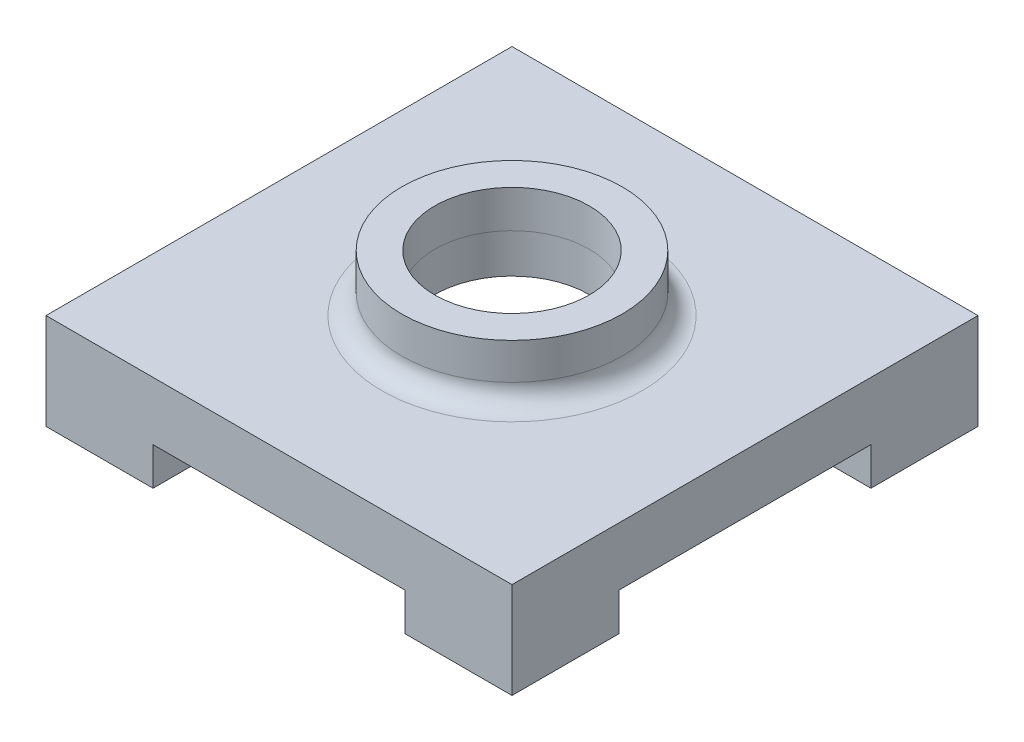
ISO-10303-21;
HEADER;
FILE_DESCRIPTION(('STEP AP214'),'2;1');
FILE_NAME('part.step','',(''),(''),'','','');
FILE_SCHEMA(('AUTOMOTIVE_DESIGN { 1 0 10303 214 1 1 1 1 }'));
ENDSEC;
DATA;
#1=APPLICATION_CONTEXT('core data for automotive mechanical design processes');
#2=APPLICATION_PROTOCOL_DEFINITION('international standard','automotive_design',2000,#1);
#3=PRODUCT_CONTEXT('',#1,'mechanical');
#4=PRODUCT('Part','Part','',(#3));
#5=PRODUCT_RELATED_PRODUCT_CATEGORY('part','',(#4));
#6=PRODUCT_DEFINITION_FORMATION('','',#4);
#7=PRODUCT_DEFINITION_CONTEXT('part definition',#1,'design');
#8=PRODUCT_DEFINITION('design','',#6,#7);
#9=PRODUCT_DEFINITION_SHAPE('','',#8);
#10=(LENGTH_UNIT() NAMED_UNIT(*) SI_UNIT(.MILLI.,.METRE.));
#11=(NAMED_UNIT(*) PLANE_ANGLE_UNIT() SI_UNIT($,.RADIAN.));
#12=(NAMED_UNIT(*) SI_UNIT($,.STERADIAN.) SOLID_ANGLE_UNIT());
#13=UNCERTAINTY_MEASURE_WITH_UNIT(LENGTH_MEASURE(1.E-05),#10,'distance_accuracy_value','');
#14=(GEOMETRIC_REPRESENTATION_CONTEXT(3) GLOBAL_UNCERTAINTY_ASSIGNED_CONTEXT((#13)) GLOBAL_UNIT_ASSIGNED_CONTEXT((#10,
#11,#12)) REPRESENTATION_CONTEXT('',''));
#15=CARTESIAN_POINT('',(0.,0.,0.));
#16=DIRECTION('',(0.,0.,1.));
#17=DIRECTION('',(1.,0.,0.));
#18=AXIS2_PLACEMENT_3D('',#15,#16,#17);
#19=CARTESIAN_POINT('',(0.,18.25,0.));
#20=DIRECTION('',(0.,1.,0.));
#21=DIRECTION('',(0.,0.,1.));
#22=AXIS2_PLACEMENT_3D('',#19,#20,#21);
#23=CYLINDRICAL_SURFACE('',#22,12.2682);
#24=CARTESIAN_POINT('',(0.,18.25,0.));
#25=DIRECTION('',(0.,1.,0.));
#26=DIRECTION('',(0.,0.,1.));
#27=AXIS2_PLACEMENT_3D('',#24,#25,#26);
#28=CIRCLE('',#27,12.2682);
#29=CARTESIAN_POINT('',(0.,18.25,12.2682));
#30=VERTEX_POINT('',#29);
#31=EDGE_CURVE('E416',#30,#30,#28,.F.);
#32=ORIENTED_EDGE('',*,*,#31,.F.);
#33=EDGE_LOOP('',(#32));
#34=FACE_BOUND('',#33,.T.);
#35=CARTESIAN_POINT('',(0.,12.,0.));
#36=DIRECTION('',(0.,-1.,0.));
#37=DIRECTION('',(0.,0.,-1.));
#38=AXIS2_PLACEMENT_3D('',#35,#36,#37);
#39=CIRCLE('',#38,12.2682);
#40=CARTESIAN_POINT('',(0.,12.,-12.2682));
#41=VERTEX_POINT('',#40);
#42=EDGE_CURVE('E48',#41,#41,#39,.F.);
#43=ORIENTED_EDGE('',*,*,#42,.F.);
#44=EDGE_LOOP('',(#43));
#45=FACE_BOUND('',#44,.T.);
#46=ADVANCED_FACE('F44',(#34,#45),#23,.F.);
#47=CARTESIAN_POINT('',(0.,6.,0.));
#48=DIRECTION('',(0.,1.,0.));
#49=DIRECTION('',(0.,0.,1.));
#50=AXIS2_PLACEMENT_3D('',#47,#48,#49);
#51=PLANE('',#50);
#52=DIRECTION('',(0.,0.,1.));
#53=VECTOR('',#52,1.);
#54=CARTESIAN_POINT('',(-37.,6.,0.));
#55=LINE('',#54,#53);
#56=CARTESIAN_POINT('',(-37.,6.,-20.));
#57=VERTEX_POINT('',#56);
#58=CARTESIAN_POINT('',(-37.,6.,20.));
#59=VERTEX_POINT('',#58);
#60=EDGE_CURVE('E310',#57,#59,#55,.T.);
#61=ORIENTED_EDGE('',*,*,#60,.F.);
#62=DIRECTION('',(1.,0.,0.));
#63=VECTOR('',#62,1.);
#64=CARTESIAN_POINT('',(-40.,6.,-20.));
#65=LINE('',#64,#63);
#66=CARTESIAN_POINT('',(-30.,6.,-20.));
#67=VERTEX_POINT('',#66);
#68=EDGE_CURVE('E396',#57,#67,#65,.T.);
#69=ORIENTED_EDGE('',*,*,#68,.T.);
#70=DIRECTION('',(0.,0.,1.));
#71=VECTOR('',#70,1.);
#72=CARTESIAN_POINT('',(-30.,6.,0.));
#73=LINE('',#72,#71);
#74=CARTESIAN_POINT('',(-30.,6.,20.));
#75=VERTEX_POINT('',#74);
#76=EDGE_CURVE('E371',#67,#75,#73,.T.);
#77=ORIENTED_EDGE('',*,*,#76,.T.);
#78=DIRECTION('',(-1.,0.,0.));
#79=VECTOR('',#78,1.);
#80=CARTESIAN_POINT('',(40.,6.,20.));
#81=LINE('',#80,#79);
#82=EDGE_CURVE('E398',#75,#59,#81,.T.);
#83=ORIENTED_EDGE('',*,*,#82,.T.);
#84=EDGE_LOOP('',(#61,#69,#77,#83));
#85=FACE_BOUND('',#84,.T.);
#86=ADVANCED_FACE('F479',(#85),#51,.F.);
#87=DIRECTION('',(1.,0.,0.));
#88=VECTOR('',#87,1.);
#89=CARTESIAN_POINT('',(0.,6.,37.));
#90=LINE('',#89,#88);
#91=CARTESIAN_POINT('',(-20.,6.,37.));
#92=VERTEX_POINT('',#91);
#93=CARTESIAN_POINT('',(20.,6.,37.));
#94=VERTEX_POINT('',#93);
#95=EDGE_CURVE('E325',#92,#94,#90,.T.);
#96=ORIENTED_EDGE('',*,*,#95,.F.);
#97=DIRECTION('',(0.,0.,-1.));
#98=VECTOR('',#97,1.);
#99=CARTESIAN_POINT('',(-20.,6.,-40.));
#100=LINE('',#99,#98);
#101=CARTESIAN_POINT('',(-20.,6.,30.));
#102=VERTEX_POINT('',#101);
#103=EDGE_CURVE('E420',#92,#102,#100,.T.);
#104=ORIENTED_EDGE('',*,*,#103,.T.);
#105=DIRECTION('',(1.,0.,0.));
#106=VECTOR('',#105,1.);
#107=CARTESIAN_POINT('',(0.,6.,30.));
#108=LINE('',#107,#106);
#109=CARTESIAN_POINT('',(20.,6.,30.));
#110=VERTEX_POINT('',#109);
#111=EDGE_CURVE('E440',#102,#110,#108,.T.);
#112=ORIENTED_EDGE('',*,*,#111,.T.);
#113=DIRECTION('',(0.,0.,1.));
#114=VECTOR('',#113,1.);
#115=CARTESIAN_POINT('',(20.,6.,40.));
#116=LINE('',#115,#114);
#117=EDGE_CURVE('E422',#110,#94,#116,.T.);
#118=ORIENTED_EDGE('',*,*,#117,.T.);
#119=EDGE_LOOP('',(#96,#104,#112,#118));
#120=FACE_BOUND('',#119,.T.);
#121=ADVANCED_FACE('F530',(#120),#51,.F.);
#122=DIRECTION('',(0.,0.,-1.));
#123=VECTOR('',#122,1.);
#124=CARTESIAN_POINT('',(37.,6.,0.));
#125=LINE('',#124,#123);
#126=CARTESIAN_POINT('',(37.,6.,20.));
#127=VERTEX_POINT('',#126);
#128=CARTESIAN_POINT('',(37.,6.,-20.));
#129=VERTEX_POINT('',#128);
#130=EDGE_CURVE('E319',#127,#129,#125,.T.);
#131=ORIENTED_EDGE('',*,*,#130,.F.);
#132=CARTESIAN_POINT('',(30.,6.,20.));
#133=VERTEX_POINT('',#132);
#134=EDGE_CURVE('E400',#127,#133,#81,.T.);
#135=ORIENTED_EDGE('',*,*,#134,.T.);
#136=DIRECTION('',(0.,0.,-1.));
#137=VECTOR('',#136,1.);
#138=CARTESIAN_POINT('',(30.,6.,0.));
#139=LINE('',#138,#137);
#140=CARTESIAN_POINT('',(30.,6.,-20.));
#141=VERTEX_POINT('',#140);
#142=EDGE_CURVE('E377',#133,#141,#139,.T.);
#143=ORIENTED_EDGE('',*,*,#142,.T.);
#144=EDGE_CURVE('E399',#141,#129,#65,.T.);
#145=ORIENTED_EDGE('',*,*,#144,.T.);
#146=EDGE_LOOP('',(#131,#135,#143,#145));
#147=FACE_BOUND('',#146,.T.);
#148=ADVANCED_FACE('F551',(#147),#51,.F.);
#149=CARTESIAN_POINT('',(-40.,0.,0.));
#150=DIRECTION('',(0.,-1.,0.));
#151=DIRECTION('',(0.,0.,-1.));
#152=AXIS2_PLACEMENT_3D('',#149,#150,#151);
#153=PLANE('',#152);
#154=CARTESIAN_POINT('',(-32.5,0.,32.5));
#155=DIRECTION('',(0.,-1.,0.));
#156=DIRECTION('',(0.,0.,-1.));
#157=AXIS2_PLACEMENT_3D('',#154,#155,#156);
#158=CIRCLE('',#157,1.65);
#159=CARTESIAN_POINT('',(-32.5,0.,30.85));
#160=VERTEX_POINT('',#159);
#161=EDGE_CURVE('E353',#160,#160,#158,.T.);
#162=ORIENTED_EDGE('',*,*,#161,.F.);
#163=EDGE_LOOP('',(#162));
#164=FACE_BOUND('',#163,.T.);
#165=DIRECTION('',(1.,0.,0.));
#166=VECTOR('',#165,1.);
#167=CARTESIAN_POINT('',(-37.,0.,37.));
#168=LINE('',#167,#166);
#169=CARTESIAN_POINT('',(-37.,0.,37.));
#170=VERTEX_POINT('',#169);
#171=CARTESIAN_POINT('',(-20.,0.,37.));
#172=VERTEX_POINT('',#171);
#173=EDGE_CURVE('E289',#170,#172,#168,.T.);
#174=ORIENTED_EDGE('',*,*,#173,.F.);
#175=DIRECTION('',(0.,0.,1.));
#176=VECTOR('',#175,1.);
#177=CARTESIAN_POINT('',(-37.,0.,-37.));
#178=LINE('',#177,#176);
#179=CARTESIAN_POINT('',(-37.,0.,20.));
#180=VERTEX_POINT('',#179);
#181=EDGE_CURVE('E288',#180,#170,#178,.T.);
#182=ORIENTED_EDGE('',*,*,#181,.F.);
#183=DIRECTION('',(-1.,0.,0.));
#184=VECTOR('',#183,1.);
#185=CARTESIAN_POINT('',(40.,0.,20.));
#186=LINE('',#185,#184);
#187=CARTESIAN_POINT('',(-30.,0.,20.));
#188=VERTEX_POINT('',#187);
#189=EDGE_CURVE('E405',#188,#180,#186,.T.);
#190=ORIENTED_EDGE('',*,*,#189,.F.);
#191=DIRECTION('',(0.,0.,-1.));
#192=VECTOR('',#191,1.);
#193=CARTESIAN_POINT('',(-30.,0.,30.));
#194=LINE('',#193,#192);
#195=CARTESIAN_POINT('',(-30.,0.,26.825));
#196=VERTEX_POINT('',#195);
#197=EDGE_CURVE('E360',#196,#188,#194,.T.);
#198=ORIENTED_EDGE('',*,*,#197,.F.);
#199=CARTESIAN_POINT('',(-26.825,0.,26.825));
#200=DIRECTION('',(0.,-1.,0.));
#201=DIRECTION('',(0.,0.,-1.));
#202=AXIS2_PLACEMENT_3D('',#199,#200,#201);
#203=CIRCLE('',#202,3.175);
#204=CARTESIAN_POINT('',(-26.825,0.,30.));
#205=VERTEX_POINT('',#204);
#206=EDGE_CURVE('E464',#196,#205,#203,.F.);
#207=ORIENTED_EDGE('',*,*,#206,.T.);
#208=DIRECTION('',(-1.,0.,0.));
#209=VECTOR('',#208,1.);
#210=CARTESIAN_POINT('',(30.,0.,30.));
#211=LINE('',#210,#209);
#212=CARTESIAN_POINT('',(-20.,0.,30.));
#213=VERTEX_POINT('',#212);
#214=EDGE_CURVE('E368',#213,#205,#211,.T.);
#215=ORIENTED_EDGE('',*,*,#214,.F.);
#216=DIRECTION('',(0.,0.,-1.));
#217=VECTOR('',#216,1.);
#218=CARTESIAN_POINT('',(-20.,0.,-40.));
#219=LINE('',#218,#217);
#220=EDGE_CURVE('E427',#172,#213,#219,.T.);
#221=ORIENTED_EDGE('',*,*,#220,.F.);
#222=EDGE_LOOP('',(#174,#182,#190,#198,#207,#215,#221));
#223=FACE_BOUND('',#222,.T.);
#224=ADVANCED_FACE('F508',(#164,#223),#153,.T.);
#225=CARTESIAN_POINT('',(32.5,0.,32.5));
#226=DIRECTION('',(0.,-1.,0.));
#227=DIRECTION('',(0.,0.,-1.));
#228=AXIS2_PLACEMENT_3D('',#225,#226,#227);
#229=CIRCLE('',#228,1.65);
#230=CARTESIAN_POINT('',(32.5,0.,30.85));
#231=VERTEX_POINT('',#230);
#232=EDGE_CURVE('E347',#231,#231,#229,.T.);
#233=ORIENTED_EDGE('',*,*,#232,.F.);
#234=EDGE_LOOP('',(#233));
#235=FACE_BOUND('',#234,.T.);
#236=CARTESIAN_POINT('',(37.,0.,20.));
#237=VERTEX_POINT('',#236);
#238=CARTESIAN_POINT('',(30.,0.,20.));
#239=VERTEX_POINT('',#238);
#240=EDGE_CURVE('E406',#237,#239,#186,.T.);
#241=ORIENTED_EDGE('',*,*,#240,.F.);
#242=DIRECTION('',(0.,0.,-1.));
#243=VECTOR('',#242,1.);
#244=CARTESIAN_POINT('',(37.,0.,37.));
#245=LINE('',#244,#243);
#246=CARTESIAN_POINT('',(37.,0.,37.));
#247=VERTEX_POINT('',#246);
#248=EDGE_CURVE('E292',#247,#237,#245,.T.);
#249=ORIENTED_EDGE('',*,*,#248,.F.);
#250=CARTESIAN_POINT('',(20.,0.,37.));
#251=VERTEX_POINT('',#250);
#252=EDGE_CURVE('E287',#251,#247,#168,.T.);
#253=ORIENTED_EDGE('',*,*,#252,.F.);
#254=DIRECTION('',(0.,0.,1.));
#255=VECTOR('',#254,1.);
#256=CARTESIAN_POINT('',(20.,0.,40.));
#257=LINE('',#256,#255);
#258=CARTESIAN_POINT('',(20.,0.,30.));
#259=VERTEX_POINT('',#258);
#260=EDGE_CURVE('E429',#259,#251,#257,.T.);
#261=ORIENTED_EDGE('',*,*,#260,.F.);
#262=CARTESIAN_POINT('',(26.825,0.,30.));
#263=VERTEX_POINT('',#262);
#264=EDGE_CURVE('E369',#263,#259,#211,.T.);
#265=ORIENTED_EDGE('',*,*,#264,.F.);
#266=CARTESIAN_POINT('',(26.825,0.,26.825));
#267=DIRECTION('',(0.,-1.,0.));
#268=DIRECTION('',(0.,0.,-1.));
#269=AXIS2_PLACEMENT_3D('',#266,#267,#268);
#270=CIRCLE('',#269,3.175);
#271=CARTESIAN_POINT('',(30.,0.,26.825));
#272=VERTEX_POINT('',#271);
#273=EDGE_CURVE('E250',#263,#272,#270,.F.);
#274=ORIENTED_EDGE('',*,*,#273,.T.);
#275=DIRECTION('',(0.,0.,1.));
#276=VECTOR('',#275,1.);
#277=CARTESIAN_POINT('',(30.,0.,-30.));
#278=LINE('',#277,#276);
#279=EDGE_CURVE('E365',#239,#272,#278,.T.);
#280=ORIENTED_EDGE('',*,*,#279,.F.);
#281=EDGE_LOOP('',(#241,#249,#253,#261,#265,#274,#280));
#282=FACE_BOUND('',#281,.T.);
#283=ADVANCED_FACE('F540',(#235,#282),#153,.T.);
#284=CARTESIAN_POINT('',(-20.,6.,-40.));
#285=DIRECTION('',(-1.,0.,0.));
#286=DIRECTION('',(0.,0.,1.));
#287=AXIS2_PLACEMENT_3D('',#284,#285,#286);
#288=PLANE('',#287);
#289=DIRECTION('',(0.,1.,0.));
#290=VECTOR('',#289,1.);
#291=CARTESIAN_POINT('',(-20.,5.99999999999999,37.));
#292=LINE('',#291,#290);
#293=EDGE_CURVE('E327',#172,#92,#292,.T.);
#294=ORIENTED_EDGE('',*,*,#293,.F.);
#295=ORIENTED_EDGE('',*,*,#220,.T.);
#296=DIRECTION('',(0.,1.,0.));
#297=VECTOR('',#296,1.);
#298=CARTESIAN_POINT('',(-20.,6.,30.));
#299=LINE('',#298,#297);
#300=EDGE_CURVE('E392',#213,#102,#299,.T.);
#301=ORIENTED_EDGE('',*,*,#300,.T.);
#302=ORIENTED_EDGE('',*,*,#103,.F.);
#303=EDGE_LOOP('',(#294,#295,#301,#302));
#304=FACE_BOUND('',#303,.T.);
#305=ADVANCED_FACE('F523',(#304),#288,.F.);
#306=CARTESIAN_POINT('',(20.,6.,40.));
#307=DIRECTION('',(1.,0.,0.));
#308=DIRECTION('',(0.,0.,-1.));
#309=AXIS2_PLACEMENT_3D('',#306,#307,#308);
#310=PLANE('',#309);
#311=DIRECTION('',(0.,-1.,0.));
#312=VECTOR('',#311,1.);
#313=CARTESIAN_POINT('',(20.,6.,37.));
#314=LINE('',#313,#312);
#315=EDGE_CURVE('E323',#94,#251,#314,.T.);
#316=ORIENTED_EDGE('',*,*,#315,.F.);
#317=ORIENTED_EDGE('',*,*,#117,.F.);
#318=DIRECTION('',(0.,-1.,0.));
#319=VECTOR('',#318,1.);
#320=CARTESIAN_POINT('',(20.,6.,30.));
#321=LINE('',#320,#319);
#322=EDGE_CURVE('E389',#110,#259,#321,.T.);
#323=ORIENTED_EDGE('',*,*,#322,.T.);
#324=ORIENTED_EDGE('',*,*,#260,.T.);
#325=EDGE_LOOP('',(#316,#317,#323,#324));
#326=FACE_BOUND('',#325,.T.);
#327=ADVANCED_FACE('F533',(#326),#310,.F.);
#328=CARTESIAN_POINT('',(-32.5,0.,-32.5));
#329=DIRECTION('',(0.,-1.,0.));
#330=DIRECTION('',(0.,0.,-1.));
#331=AXIS2_PLACEMENT_3D('',#328,#329,#330);
#332=CIRCLE('',#331,1.65);
#333=CARTESIAN_POINT('',(-32.5,0.,-34.15));
#334=VERTEX_POINT('',#333);
#335=EDGE_CURVE('E335',#334,#334,#332,.T.);
#336=ORIENTED_EDGE('',*,*,#335,.F.);
#337=EDGE_LOOP('',(#336));
#338=FACE_BOUND('',#337,.T.);
#339=DIRECTION('',(1.,0.,0.));
#340=VECTOR('',#339,1.);
#341=CARTESIAN_POINT('',(-40.,0.,-20.));
#342=LINE('',#341,#340);
#343=CARTESIAN_POINT('',(-37.,0.,-20.));
#344=VERTEX_POINT('',#343);
#345=CARTESIAN_POINT('',(-30.,0.,-20.));
#346=VERTEX_POINT('',#345);
#347=EDGE_CURVE('E403',#344,#346,#342,.T.);
#348=ORIENTED_EDGE('',*,*,#347,.F.);
#349=CARTESIAN_POINT('',(-37.,0.,-37.));
#350=VERTEX_POINT('',#349);
#351=EDGE_CURVE('E68',#350,#344,#178,.T.);
#352=ORIENTED_EDGE('',*,*,#351,.F.);
#353=DIRECTION('',(-1.,0.,0.));
#354=VECTOR('',#353,1.);
#355=CARTESIAN_POINT('',(37.,0.,-37.));
#356=LINE('',#355,#354);
#357=CARTESIAN_POINT('',(-20.,0.,-37.));
#358=VERTEX_POINT('',#357);
#359=EDGE_CURVE('E294',#358,#350,#356,.T.);
#360=ORIENTED_EDGE('',*,*,#359,.F.);
#361=CARTESIAN_POINT('',(-20.,0.,-30.));
#362=VERTEX_POINT('',#361);
#363=EDGE_CURVE('E419',#362,#358,#219,.T.);
#364=ORIENTED_EDGE('',*,*,#363,.F.);
#365=DIRECTION('',(1.,0.,0.));
#366=VECTOR('',#365,1.);
#367=CARTESIAN_POINT('',(-30.,0.,-30.));
#368=LINE('',#367,#366);
#369=CARTESIAN_POINT('',(-26.825,0.,-30.));
#370=VERTEX_POINT('',#369);
#371=EDGE_CURVE('E363',#370,#362,#368,.T.);
#372=ORIENTED_EDGE('',*,*,#371,.F.);
#373=CARTESIAN_POINT('',(-26.825,0.,-26.825));
#374=DIRECTION('',(0.,-1.,0.));
#375=DIRECTION('',(0.,0.,-1.));
#376=AXIS2_PLACEMENT_3D('',#373,#374,#375);
#377=CIRCLE('',#376,3.175);
#378=CARTESIAN_POINT('',(-30.,0.,-26.825));
#379=VERTEX_POINT('',#378);
#380=EDGE_CURVE('E469',#370,#379,#377,.F.);
#381=ORIENTED_EDGE('',*,*,#380,.T.);
#382=EDGE_CURVE('E359',#346,#379,#194,.T.);
#383=ORIENTED_EDGE('',*,*,#382,.F.);
#384=EDGE_LOOP('',(#348,#352,#360,#364,#372,#381,#383));
#385=FACE_BOUND('',#384,.T.);
#386=ADVANCED_FACE('F490',(#338,#385),#153,.T.);
#387=CARTESIAN_POINT('',(32.5,0.,-32.5));
#388=DIRECTION('',(0.,-1.,0.));
#389=DIRECTION('',(0.,0.,-1.));
#390=AXIS2_PLACEMENT_3D('',#387,#388,#389);
#391=CIRCLE('',#390,1.65);
#392=CARTESIAN_POINT('',(32.5,0.,-34.15));
#393=VERTEX_POINT('',#392);
#394=EDGE_CURVE('E341',#393,#393,#391,.T.);
#395=ORIENTED_EDGE('',*,*,#394,.F.);
#396=EDGE_LOOP('',(#395));
#397=FACE_BOUND('',#396,.T.);
#398=CARTESIAN_POINT('',(20.,0.,-37.));
#399=VERTEX_POINT('',#398);
#400=CARTESIAN_POINT('',(20.,0.,-30.));
#401=VERTEX_POINT('',#400);
#402=EDGE_CURVE('E430',#399,#401,#257,.T.);
#403=ORIENTED_EDGE('',*,*,#402,.F.);
#404=CARTESIAN_POINT('',(37.,0.,-37.));
#405=VERTEX_POINT('',#404);
#406=EDGE_CURVE('E295',#405,#399,#356,.T.);
#407=ORIENTED_EDGE('',*,*,#406,.F.);
#408=CARTESIAN_POINT('',(37.,0.,-20.));
#409=VERTEX_POINT('',#408);
#410=EDGE_CURVE('E291',#409,#405,#245,.T.);
#411=ORIENTED_EDGE('',*,*,#410,.F.);
#412=CARTESIAN_POINT('',(30.,0.,-20.));
#413=VERTEX_POINT('',#412);
#414=EDGE_CURVE('E395',#413,#409,#342,.T.);
#415=ORIENTED_EDGE('',*,*,#414,.F.);
#416=CARTESIAN_POINT('',(30.,0.,-26.825));
#417=VERTEX_POINT('',#416);
#418=EDGE_CURVE('E366',#417,#413,#278,.T.);
#419=ORIENTED_EDGE('',*,*,#418,.F.);
#420=CARTESIAN_POINT('',(26.825,0.,-26.825));
#421=DIRECTION('',(0.,-1.,0.));
#422=DIRECTION('',(0.,0.,-1.));
#423=AXIS2_PLACEMENT_3D('',#420,#421,#422);
#424=CIRCLE('',#423,3.175);
#425=CARTESIAN_POINT('',(26.825,0.,-30.));
#426=VERTEX_POINT('',#425);
#427=EDGE_CURVE('E467',#417,#426,#424,.F.);
#428=ORIENTED_EDGE('',*,*,#427,.T.);
#429=EDGE_CURVE('E362',#401,#426,#368,.T.);
#430=ORIENTED_EDGE('',*,*,#429,.F.);
#431=EDGE_LOOP('',(#403,#407,#411,#415,#419,#428,#430));
#432=FACE_BOUND('',#431,.T.);
#433=ADVANCED_FACE('F566',(#397,#432),#153,.T.);
#434=DIRECTION('',(0.,-1.,0.));
#435=VECTOR('',#434,1.);
#436=CARTESIAN_POINT('',(-20.,6.,-37.));
#437=LINE('',#436,#435);
#438=CARTESIAN_POINT('',(-20.,6.,-37.));
#439=VERTEX_POINT('',#438);
#440=EDGE_CURVE('E333',#439,#358,#437,.T.);
#441=ORIENTED_EDGE('',*,*,#440,.F.);
#442=CARTESIAN_POINT('',(-20.,6.,-30.));
#443=VERTEX_POINT('',#442);
#444=EDGE_CURVE('E423',#443,#439,#100,.T.);
#445=ORIENTED_EDGE('',*,*,#444,.F.);
#446=DIRECTION('',(0.,-1.,0.));
#447=VECTOR('',#446,1.);
#448=CARTESIAN_POINT('',(-20.,6.,-30.));
#449=LINE('',#448,#447);
#450=EDGE_CURVE('E386',#443,#362,#449,.T.);
#451=ORIENTED_EDGE('',*,*,#450,.T.);
#452=ORIENTED_EDGE('',*,*,#363,.T.);
#453=EDGE_LOOP('',(#441,#445,#451,#452));
#454=FACE_BOUND('',#453,.T.);
#455=ADVANCED_FACE('F579',(#454),#288,.F.);
#456=DIRECTION('',(0.,1.,0.));
#457=VECTOR('',#456,1.);
#458=CARTESIAN_POINT('',(20.,6.00000000000001,-37.));
#459=LINE('',#458,#457);
#460=CARTESIAN_POINT('',(20.,6.,-37.));
#461=VERTEX_POINT('',#460);
#462=EDGE_CURVE('E331',#399,#461,#459,.T.);
#463=ORIENTED_EDGE('',*,*,#462,.F.);
#464=ORIENTED_EDGE('',*,*,#402,.T.);
#465=DIRECTION('',(0.,1.,0.));
#466=VECTOR('',#465,1.);
#467=CARTESIAN_POINT('',(20.,6.,-30.));
#468=LINE('',#467,#466);
#469=CARTESIAN_POINT('',(20.,6.,-30.));
#470=VERTEX_POINT('',#469);
#471=EDGE_CURVE('E383',#401,#470,#468,.T.);
#472=ORIENTED_EDGE('',*,*,#471,.T.);
#473=EDGE_CURVE('E424',#461,#470,#116,.T.);
#474=ORIENTED_EDGE('',*,*,#473,.F.);
#475=EDGE_LOOP('',(#463,#464,#472,#474));
#476=FACE_BOUND('',#475,.T.);
#477=ADVANCED_FACE('F589',(#476),#310,.F.);
#478=DIRECTION('',(-1.,0.,0.));
#479=VECTOR('',#478,1.);
#480=CARTESIAN_POINT('',(0.,6.,-37.));
#481=LINE('',#480,#479);
#482=EDGE_CURVE('E329',#461,#439,#481,.T.);
#483=ORIENTED_EDGE('',*,*,#482,.F.);
#484=ORIENTED_EDGE('',*,*,#473,.T.);
#485=DIRECTION('',(-1.,0.,0.));
#486=VECTOR('',#485,1.);
#487=CARTESIAN_POINT('',(0.,6.,-30.));
#488=LINE('',#487,#486);
#489=EDGE_CURVE('E437',#470,#443,#488,.T.);
#490=ORIENTED_EDGE('',*,*,#489,.T.);
#491=ORIENTED_EDGE('',*,*,#444,.T.);
#492=EDGE_LOOP('',(#483,#484,#490,#491));
#493=FACE_BOUND('',#492,.T.);
#494=ADVANCED_FACE('F586',(#493),#51,.F.);
#495=CARTESIAN_POINT('',(0.,15.25,0.));
#496=DIRECTION('',(0.,-1.,0.));
#497=DIRECTION('',(0.,0.,-1.));
#498=AXIS2_PLACEMENT_3D('',#495,#496,#497);
#499=PLANE('',#498);
#500=CARTESIAN_POINT('',(0.,15.25,0.));
#501=DIRECTION('',(0.,-1.,0.));
#502=DIRECTION('',(0.,0.,-1.));
#503=AXIS2_PLACEMENT_3D('',#500,#501,#502);
#504=CIRCLE('',#503,20.675);
#505=CARTESIAN_POINT('',(0.,15.25,-20.675));
#506=VERTEX_POINT('',#505);
#507=EDGE_CURVE('E461',#506,#506,#504,.T.);
#508=ORIENTED_EDGE('',*,*,#507,.T.);
#509=EDGE_LOOP('',(#508));
#510=FACE_BOUND('',#509,.T.);
#511=DIRECTION('',(0.,0.,1.));
#512=VECTOR('',#511,1.);
#513=CARTESIAN_POINT('',(-37.,15.25,-37.));
#514=LINE('',#513,#512);
#515=CARTESIAN_POINT('',(-37.,15.25,-37.));
#516=VERTEX_POINT('',#515);
#517=CARTESIAN_POINT('',(-37.,15.25,37.));
#518=VERTEX_POINT('',#517);
#519=EDGE_CURVE('E298',#516,#518,#514,.T.);
#520=ORIENTED_EDGE('',*,*,#519,.T.);
#521=DIRECTION('',(1.,0.,0.));
#522=VECTOR('',#521,1.);
#523=CARTESIAN_POINT('',(-37.,15.25,37.));
#524=LINE('',#523,#522);
#525=CARTESIAN_POINT('',(37.,15.25,37.));
#526=VERTEX_POINT('',#525);
#527=EDGE_CURVE('E301',#518,#526,#524,.T.);
#528=ORIENTED_EDGE('',*,*,#527,.T.);
#529=DIRECTION('',(0.,0.,-1.));
#530=VECTOR('',#529,1.);
#531=CARTESIAN_POINT('',(37.,15.25,37.));
#532=LINE('',#531,#530);
#533=CARTESIAN_POINT('',(37.,15.25,-37.));
#534=VERTEX_POINT('',#533);
#535=EDGE_CURVE('E60',#526,#534,#532,.T.);
#536=ORIENTED_EDGE('',*,*,#535,.T.);
#537=DIRECTION('',(-1.,0.,0.));
#538=VECTOR('',#537,1.);
#539=CARTESIAN_POINT('',(37.,15.25,-37.));
#540=LINE('',#539,#538);
#541=EDGE_CURVE('E305',#534,#516,#540,.T.);
#542=ORIENTED_EDGE('',*,*,#541,.T.);
#543=EDGE_LOOP('',(#520,#528,#536,#542));
#544=FACE_BOUND('',#543,.T.);
#545=ADVANCED_FACE('F574',(#510,#544),#499,.F.);
#546=CARTESIAN_POINT('',(-40.,6.,-20.));
#547=DIRECTION('',(0.,0.,-1.));
#548=DIRECTION('',(-1.,0.,0.));
#549=AXIS2_PLACEMENT_3D('',#546,#547,#548);
#550=PLANE('',#549);
#551=DIRECTION('',(0.,-1.,0.));
#552=VECTOR('',#551,1.);
#553=CARTESIAN_POINT('',(37.,6.,-20.));
#554=LINE('',#553,#552);
#555=EDGE_CURVE('E321',#129,#409,#554,.T.);
#556=ORIENTED_EDGE('',*,*,#555,.F.);
#557=ORIENTED_EDGE('',*,*,#144,.F.);
#558=DIRECTION('',(0.,-1.,0.));
#559=VECTOR('',#558,1.);
#560=CARTESIAN_POINT('',(30.,6.,-20.));
#561=LINE('',#560,#559);
#562=EDGE_CURVE('E380',#141,#413,#561,.T.);
#563=ORIENTED_EDGE('',*,*,#562,.T.);
#564=ORIENTED_EDGE('',*,*,#414,.T.);
#565=EDGE_LOOP('',(#556,#557,#563,#564));
#566=FACE_BOUND('',#565,.T.);
#567=ADVANCED_FACE('F562',(#566),#550,.F.);
#568=CARTESIAN_POINT('',(40.,6.,20.));
#569=DIRECTION('',(0.,0.,1.));
#570=DIRECTION('',(1.,0.,0.));
#571=AXIS2_PLACEMENT_3D('',#568,#569,#570);
#572=PLANE('',#571);
#573=DIRECTION('',(0.,1.,0.));
#574=VECTOR('',#573,1.);
#575=CARTESIAN_POINT('',(37.,6.,20.));
#576=LINE('',#575,#574);
#577=EDGE_CURVE('E12',#237,#127,#576,.T.);
#578=ORIENTED_EDGE('',*,*,#577,.F.);
#579=ORIENTED_EDGE('',*,*,#240,.T.);
#580=DIRECTION('',(0.,1.,0.));
#581=VECTOR('',#580,1.);
#582=CARTESIAN_POINT('',(30.,6.,20.));
#583=LINE('',#582,#581);
#584=EDGE_CURVE('E434',#239,#133,#583,.T.);
#585=ORIENTED_EDGE('',*,*,#584,.T.);
#586=ORIENTED_EDGE('',*,*,#134,.F.);
#587=EDGE_LOOP('',(#578,#579,#585,#586));
#588=FACE_BOUND('',#587,.T.);
#589=ADVANCED_FACE('F547',(#588),#572,.F.);
#590=DIRECTION('',(0.,-1.,0.));
#591=VECTOR('',#590,1.);
#592=CARTESIAN_POINT('',(-37.,6.,20.));
#593=LINE('',#592,#591);
#594=EDGE_CURVE('E317',#59,#180,#593,.T.);
#595=ORIENTED_EDGE('',*,*,#594,.F.);
#596=ORIENTED_EDGE('',*,*,#82,.F.);
#597=DIRECTION('',(0.,-1.,0.));
#598=VECTOR('',#597,1.);
#599=CARTESIAN_POINT('',(-30.,6.,20.));
#600=LINE('',#599,#598);
#601=EDGE_CURVE('E374',#75,#188,#600,.T.);
#602=ORIENTED_EDGE('',*,*,#601,.T.);
#603=ORIENTED_EDGE('',*,*,#189,.T.);
#604=EDGE_LOOP('',(#595,#596,#602,#603));
#605=FACE_BOUND('',#604,.T.);
#606=ADVANCED_FACE('F513',(#605),#572,.F.);
#607=DIRECTION('',(0.,1.,0.));
#608=VECTOR('',#607,1.);
#609=CARTESIAN_POINT('',(-37.,6.,-20.));
#610=LINE('',#609,#608);
#611=EDGE_CURVE('E53',#344,#57,#610,.T.);
#612=ORIENTED_EDGE('',*,*,#611,.F.);
#613=ORIENTED_EDGE('',*,*,#347,.T.);
#614=DIRECTION('',(0.,1.,0.));
#615=VECTOR('',#614,1.);
#616=CARTESIAN_POINT('',(-30.,6.,-20.));
#617=LINE('',#616,#615);
#618=EDGE_CURVE('E426',#346,#67,#617,.T.);
#619=ORIENTED_EDGE('',*,*,#618,.T.);
#620=ORIENTED_EDGE('',*,*,#68,.F.);
#621=EDGE_LOOP('',(#612,#613,#619,#620));
#622=FACE_BOUND('',#621,.T.);
#623=ADVANCED_FACE('F482',(#622),#550,.F.);
#624=CARTESIAN_POINT('',(0.,18.25,0.));
#625=DIRECTION('',(0.,1.,0.));
#626=DIRECTION('',(0.,0.,1.));
#627=AXIS2_PLACEMENT_3D('',#624,#625,#626);
#628=PLANE('',#627);
#629=CARTESIAN_POINT('',(0.,18.25,0.));
#630=DIRECTION('',(0.,1.,0.));
#631=DIRECTION('',(0.,0.,1.));
#632=AXIS2_PLACEMENT_3D('',#629,#630,#631);
#633=CIRCLE('',#632,12.268);
#634=CARTESIAN_POINT('',(0.,18.25,12.268));
#635=VERTEX_POINT('',#634);
#636=EDGE_CURVE('E402',#635,#635,#633,.T.);
#637=ORIENTED_EDGE('',*,*,#636,.T.);
#638=EDGE_LOOP('',(#637));
#639=FACE_BOUND('',#638,.T.);
#640=ORIENTED_EDGE('',*,*,#31,.T.);
#641=EDGE_LOOP('',(#640));
#642=FACE_BOUND('',#641,.T.);
#643=ADVANCED_FACE('F645',(#639,#642),#628,.F.);
#644=CARTESIAN_POINT('',(0.,24.2062,0.));
#645=DIRECTION('',(0.,1.,0.));
#646=DIRECTION('',(0.,0.,1.));
#647=AXIS2_PLACEMENT_3D('',#644,#645,#646);
#648=PLANE('',#647);
#649=CARTESIAN_POINT('',(0.,24.2062,0.));
#650=DIRECTION('',(0.,1.,0.));
#651=DIRECTION('',(0.,0.,1.));
#652=AXIS2_PLACEMENT_3D('',#649,#650,#651);
#653=CIRCLE('',#652,17.5);
#654=CARTESIAN_POINT('',(0.,24.2062,17.5));
#655=VERTEX_POINT('',#654);
#656=EDGE_CURVE('E411',#655,#655,#653,.T.);
#657=ORIENTED_EDGE('',*,*,#656,.T.);
#658=EDGE_LOOP('',(#657));
#659=FACE_BOUND('',#658,.T.);
#660=CARTESIAN_POINT('',(0.,24.2062,0.));
#661=DIRECTION('',(0.,1.,0.));
#662=DIRECTION('',(0.,0.,1.));
#663=AXIS2_PLACEMENT_3D('',#660,#661,#662);
#664=CIRCLE('',#663,12.268);
#665=CARTESIAN_POINT('',(0.,24.2062,12.268));
#666=VERTEX_POINT('',#665);
#667=EDGE_CURVE('E408',#666,#666,#664,.T.);
#668=ORIENTED_EDGE('',*,*,#667,.F.);
#669=EDGE_LOOP('',(#668));
#670=FACE_BOUND('',#669,.T.);
#671=ADVANCED_FACE('F643',(#659,#670),#648,.T.);
#672=CARTESIAN_POINT('',(0.,24.2062,0.));
#673=DIRECTION('',(0.,-1.,0.));
#674=DIRECTION('',(0.,0.,-1.));
#675=AXIS2_PLACEMENT_3D('',#672,#673,#674);
#676=CYLINDRICAL_SURFACE('',#675,17.5);
#677=CARTESIAN_POINT('',(0.,18.425,0.));
#678=DIRECTION('',(0.,-1.,0.));
#679=DIRECTION('',(0.,0.,-1.));
#680=AXIS2_PLACEMENT_3D('',#677,#678,#679);
#681=CIRCLE('',#680,17.5);
#682=CARTESIAN_POINT('',(0.,18.425,-17.5));
#683=VERTEX_POINT('',#682);
#684=EDGE_CURVE('E458',#683,#683,#681,.F.);
#685=ORIENTED_EDGE('',*,*,#684,.T.);
#686=EDGE_LOOP('',(#685));
#687=FACE_BOUND('',#686,.T.);
#688=ORIENTED_EDGE('',*,*,#656,.F.);
#689=EDGE_LOOP('',(#688));
#690=FACE_BOUND('',#689,.T.);
#691=ADVANCED_FACE('F611',(#687,#690),#676,.T.);
#692=CARTESIAN_POINT('',(0.,24.2062,0.));
#693=DIRECTION('',(0.,-1.,0.));
#694=DIRECTION('',(0.,0.,-1.));
#695=AXIS2_PLACEMENT_3D('',#692,#693,#694);
#696=CYLINDRICAL_SURFACE('',#695,12.268);
#697=ORIENTED_EDGE('',*,*,#667,.T.);
#698=EDGE_LOOP('',(#697));
#699=FACE_BOUND('',#698,.T.);
#700=ORIENTED_EDGE('',*,*,#636,.F.);
#701=EDGE_LOOP('',(#700));
#702=FACE_BOUND('',#701,.T.);
#703=ADVANCED_FACE('F639',(#699,#702),#696,.F.);
#704=CARTESIAN_POINT('',(30.,9.,30.));
#705=DIRECTION('',(0.,0.,1.));
#706=DIRECTION('',(1.,0.,0.));
#707=AXIS2_PLACEMENT_3D('',#704,#705,#706);
#708=PLANE('',#707);
#709=ORIENTED_EDGE('',*,*,#214,.T.);
#710=DIRECTION('',(0.,-1.,0.));
#711=VECTOR('',#710,1.);
#712=CARTESIAN_POINT('',(-26.825,9.,30.));
#713=LINE('',#712,#711);
#714=CARTESIAN_POINT('',(-26.825,12.,30.));
#715=VERTEX_POINT('',#714);
#716=EDGE_CURVE('E253',#205,#715,#713,.F.);
#717=ORIENTED_EDGE('',*,*,#716,.T.);
#718=DIRECTION('',(-1.,0.,0.));
#719=VECTOR('',#718,1.);
#720=CARTESIAN_POINT('',(26.825,12.,30.));
#721=LINE('',#720,#719);
#722=CARTESIAN_POINT('',(26.825,12.,30.));
#723=VERTEX_POINT('',#722);
#724=EDGE_CURVE('E257',#723,#715,#721,.T.);
#725=ORIENTED_EDGE('',*,*,#724,.F.);
#726=DIRECTION('',(0.,-1.,0.));
#727=VECTOR('',#726,1.);
#728=CARTESIAN_POINT('',(26.825,0.,30.));
#729=LINE('',#728,#727);
#730=EDGE_CURVE('E243',#723,#263,#729,.T.);
#731=ORIENTED_EDGE('',*,*,#730,.T.);
#732=ORIENTED_EDGE('',*,*,#264,.T.);
#733=ORIENTED_EDGE('',*,*,#322,.F.);
#734=ORIENTED_EDGE('',*,*,#111,.F.);
#735=ORIENTED_EDGE('',*,*,#300,.F.);
#736=EDGE_LOOP('',(#709,#717,#725,#731,#732,#733,#734,#735));
#737=FACE_BOUND('',#736,.T.);
#738=ADVANCED_FACE('F259',(#737),#708,.F.);
#739=CARTESIAN_POINT('',(-30.,9.,-30.));
#740=DIRECTION('',(0.,0.,-1.));
#741=DIRECTION('',(-1.,0.,0.));
#742=AXIS2_PLACEMENT_3D('',#739,#740,#741);
#743=PLANE('',#742);
#744=ORIENTED_EDGE('',*,*,#429,.T.);
#745=DIRECTION('',(0.,-1.,0.));
#746=VECTOR('',#745,1.);
#747=CARTESIAN_POINT('',(26.825,9.,-30.));
#748=LINE('',#747,#746);
#749=CARTESIAN_POINT('',(26.825,12.,-30.));
#750=VERTEX_POINT('',#749);
#751=EDGE_CURVE('E456',#426,#750,#748,.F.);
#752=ORIENTED_EDGE('',*,*,#751,.T.);
#753=DIRECTION('',(1.,0.,0.));
#754=VECTOR('',#753,1.);
#755=CARTESIAN_POINT('',(-26.825,12.,-30.));
#756=LINE('',#755,#754);
#757=CARTESIAN_POINT('',(-26.825,12.,-30.));
#758=VERTEX_POINT('',#757);
#759=EDGE_CURVE('E280',#758,#750,#756,.T.);
#760=ORIENTED_EDGE('',*,*,#759,.F.);
#761=DIRECTION('',(0.,-1.,0.));
#762=VECTOR('',#761,1.);
#763=CARTESIAN_POINT('',(-26.825,0.,-30.));
#764=LINE('',#763,#762);
#765=EDGE_CURVE('E453',#758,#370,#764,.T.);
#766=ORIENTED_EDGE('',*,*,#765,.T.);
#767=ORIENTED_EDGE('',*,*,#371,.T.);
#768=ORIENTED_EDGE('',*,*,#450,.F.);
#769=ORIENTED_EDGE('',*,*,#489,.F.);
#770=ORIENTED_EDGE('',*,*,#471,.F.);
#771=EDGE_LOOP('',(#744,#752,#760,#766,#767,#768,#769,#770));
#772=FACE_BOUND('',#771,.T.);
#773=ADVANCED_FACE('F499',(#772),#743,.F.);
#774=CARTESIAN_POINT('',(30.,9.,-30.));
#775=DIRECTION('',(1.,0.,0.));
#776=DIRECTION('',(0.,0.,-1.));
#777=AXIS2_PLACEMENT_3D('',#774,#775,#776);
#778=PLANE('',#777);
#779=ORIENTED_EDGE('',*,*,#279,.T.);
#780=DIRECTION('',(0.,-1.,0.));
#781=VECTOR('',#780,1.);
#782=CARTESIAN_POINT('',(30.,9.,26.825));
#783=LINE('',#782,#781);
#784=CARTESIAN_POINT('',(30.,12.,26.825));
#785=VERTEX_POINT('',#784);
#786=EDGE_CURVE('E451',#272,#785,#783,.F.);
#787=ORIENTED_EDGE('',*,*,#786,.T.);
#788=DIRECTION('',(0.,0.,1.));
#789=VECTOR('',#788,1.);
#790=CARTESIAN_POINT('',(30.,12.,-26.825));
#791=LINE('',#790,#789);
#792=CARTESIAN_POINT('',(30.,12.,-26.825));
#793=VERTEX_POINT('',#792);
#794=EDGE_CURVE('E270',#793,#785,#791,.T.);
#795=ORIENTED_EDGE('',*,*,#794,.F.);
#796=DIRECTION('',(0.,-1.,0.));
#797=VECTOR('',#796,1.);
#798=CARTESIAN_POINT('',(30.,0.,-26.825));
#799=LINE('',#798,#797);
#800=EDGE_CURVE('E448',#793,#417,#799,.T.);
#801=ORIENTED_EDGE('',*,*,#800,.T.);
#802=ORIENTED_EDGE('',*,*,#418,.T.);
#803=ORIENTED_EDGE('',*,*,#562,.F.);
#804=ORIENTED_EDGE('',*,*,#142,.F.);
#805=ORIENTED_EDGE('',*,*,#584,.F.);
#806=EDGE_LOOP('',(#779,#787,#795,#801,#802,#803,#804,#805));
#807=FACE_BOUND('',#806,.T.);
#808=ADVANCED_FACE('F556',(#807),#778,.F.);
#809=CARTESIAN_POINT('',(-30.,9.,30.));
#810=DIRECTION('',(-1.,0.,0.));
#811=DIRECTION('',(0.,0.,1.));
#812=AXIS2_PLACEMENT_3D('',#809,#810,#811);
#813=PLANE('',#812);
#814=DIRECTION('',(0.,-1.,0.));
#815=VECTOR('',#814,1.);
#816=CARTESIAN_POINT('',(-30.,9.,-26.825));
#817=LINE('',#816,#815);
#818=CARTESIAN_POINT('',(-30.,12.,-26.825));
#819=VERTEX_POINT('',#818);
#820=EDGE_CURVE('E443',#379,#819,#817,.F.);
#821=ORIENTED_EDGE('',*,*,#820,.T.);
#822=DIRECTION('',(0.,0.,-1.));
#823=VECTOR('',#822,1.);
#824=CARTESIAN_POINT('',(-30.,12.,26.825));
#825=LINE('',#824,#823);
#826=CARTESIAN_POINT('',(-30.,12.,26.825));
#827=VERTEX_POINT('',#826);
#828=EDGE_CURVE('E274',#827,#819,#825,.T.);
#829=ORIENTED_EDGE('',*,*,#828,.F.);
#830=DIRECTION('',(0.,-1.,0.));
#831=VECTOR('',#830,1.);
#832=CARTESIAN_POINT('',(-30.,0.,26.825));
#833=LINE('',#832,#831);
#834=EDGE_CURVE('E254',#827,#196,#833,.T.);
#835=ORIENTED_EDGE('',*,*,#834,.T.);
#836=ORIENTED_EDGE('',*,*,#197,.T.);
#837=ORIENTED_EDGE('',*,*,#601,.F.);
#838=ORIENTED_EDGE('',*,*,#76,.F.);
#839=ORIENTED_EDGE('',*,*,#618,.F.);
#840=ORIENTED_EDGE('',*,*,#382,.T.);
#841=EDGE_LOOP('',(#821,#829,#835,#836,#837,#838,#839,#840));
#842=FACE_BOUND('',#841,.T.);
#843=ADVANCED_FACE('F487',(#842),#813,.F.);
#844=CARTESIAN_POINT('',(-26.825,9.,26.825));
#845=DIRECTION('',(0.,1.,0.));
#846=DIRECTION('',(0.,0.,1.));
#847=AXIS2_PLACEMENT_3D('',#844,#845,#846);
#848=CYLINDRICAL_SURFACE('',#847,3.175);
#849=ORIENTED_EDGE('',*,*,#834,.F.);
#850=CARTESIAN_POINT('',(-26.825,12.,26.825));
#851=DIRECTION('',(0.,-1.,0.));
#852=DIRECTION('',(0.,0.,-1.));
#853=AXIS2_PLACEMENT_3D('',#850,#851,#852);
#854=CIRCLE('',#853,3.175);
#855=EDGE_CURVE('E264',#715,#827,#854,.T.);
#856=ORIENTED_EDGE('',*,*,#855,.F.);
#857=ORIENTED_EDGE('',*,*,#716,.F.);
#858=ORIENTED_EDGE('',*,*,#206,.F.);
#859=EDGE_LOOP('',(#849,#856,#857,#858));
#860=FACE_BOUND('',#859,.T.);
#861=ADVANCED_FACE('F599',(#860),#848,.F.);
#862=CARTESIAN_POINT('',(26.825,9.,26.825));
#863=DIRECTION('',(0.,1.,0.));
#864=DIRECTION('',(0.,0.,1.));
#865=AXIS2_PLACEMENT_3D('',#862,#863,#864);
#866=CYLINDRICAL_SURFACE('',#865,3.175);
#867=ORIENTED_EDGE('',*,*,#730,.F.);
#868=CARTESIAN_POINT('',(26.825,12.,26.825));
#869=DIRECTION('',(0.,-1.,0.));
#870=DIRECTION('',(0.,0.,-1.));
#871=AXIS2_PLACEMENT_3D('',#868,#869,#870);
#872=CIRCLE('',#871,3.175);
#873=EDGE_CURVE('E248',#785,#723,#872,.T.);
#874=ORIENTED_EDGE('',*,*,#873,.F.);
#875=ORIENTED_EDGE('',*,*,#786,.F.);
#876=ORIENTED_EDGE('',*,*,#273,.F.);
#877=EDGE_LOOP('',(#867,#874,#875,#876));
#878=FACE_BOUND('',#877,.T.);
#879=ADVANCED_FACE('F245',(#878),#866,.F.);
#880=CARTESIAN_POINT('',(26.825,9.,-26.825));
#881=DIRECTION('',(0.,1.,0.));
#882=DIRECTION('',(0.,0.,1.));
#883=AXIS2_PLACEMENT_3D('',#880,#881,#882);
#884=CYLINDRICAL_SURFACE('',#883,3.175);
#885=ORIENTED_EDGE('',*,*,#800,.F.);
#886=CARTESIAN_POINT('',(26.825,12.,-26.825));
#887=DIRECTION('',(0.,-1.,0.));
#888=DIRECTION('',(0.,0.,-1.));
#889=AXIS2_PLACEMENT_3D('',#886,#887,#888);
#890=CIRCLE('',#889,3.175);
#891=EDGE_CURVE('E283',#750,#793,#890,.T.);
#892=ORIENTED_EDGE('',*,*,#891,.F.);
#893=ORIENTED_EDGE('',*,*,#751,.F.);
#894=ORIENTED_EDGE('',*,*,#427,.F.);
#895=EDGE_LOOP('',(#885,#892,#893,#894));
#896=FACE_BOUND('',#895,.T.);
#897=ADVANCED_FACE('F592',(#896),#884,.F.);
#898=CARTESIAN_POINT('',(-26.825,9.,-26.825));
#899=DIRECTION('',(0.,1.,0.));
#900=DIRECTION('',(0.,0.,1.));
#901=AXIS2_PLACEMENT_3D('',#898,#899,#900);
#902=CYLINDRICAL_SURFACE('',#901,3.175);
#903=ORIENTED_EDGE('',*,*,#765,.F.);
#904=CARTESIAN_POINT('',(-26.825,12.,-26.825));
#905=DIRECTION('',(0.,-1.,0.));
#906=DIRECTION('',(0.,0.,-1.));
#907=AXIS2_PLACEMENT_3D('',#904,#905,#906);
#908=CIRCLE('',#907,3.175);
#909=EDGE_CURVE('E277',#819,#758,#908,.T.);
#910=ORIENTED_EDGE('',*,*,#909,.F.);
#911=ORIENTED_EDGE('',*,*,#820,.F.);
#912=ORIENTED_EDGE('',*,*,#380,.F.);
#913=EDGE_LOOP('',(#903,#910,#911,#912));
#914=FACE_BOUND('',#913,.T.);
#915=ADVANCED_FACE('F494',(#914),#902,.F.);
#916=CARTESIAN_POINT('',(0.,18.425,0.));
#917=DIRECTION('',(0.,-1.,0.));
#918=DIRECTION('',(0.,0.,-1.));
#919=AXIS2_PLACEMENT_3D('',#916,#917,#918);
#920=TOROIDAL_SURFACE('',#919,20.675,3.175);
#921=ORIENTED_EDGE('',*,*,#507,.F.);
#922=EDGE_LOOP('',(#921));
#923=FACE_BOUND('',#922,.T.);
#924=ORIENTED_EDGE('',*,*,#684,.F.);
#925=EDGE_LOOP('',(#924));
#926=FACE_BOUND('',#925,.T.);
#927=ADVANCED_FACE('F46',(#923,#926),#920,.F.);
#928=CARTESIAN_POINT('',(-32.5,12.,32.5));
#929=DIRECTION('',(0.,-1.,0.));
#930=DIRECTION('',(0.,0.,-1.));
#931=AXIS2_PLACEMENT_3D('',#928,#929,#930);
#932=CONICAL_SURFACE('',#931,1.65,1.02974425867665);
#933=CARTESIAN_POINT('',(-32.5,12.9914200213955,32.5));
#934=VERTEX_POINT('',#933);
#935=VERTEX_LOOP('',#934);
#936=FACE_BOUND('',#935,.T.);
#937=CARTESIAN_POINT('',(-32.5,12.,32.5));
#938=DIRECTION('',(0.,-1.,0.));
#939=DIRECTION('',(0.,0.,-1.));
#940=AXIS2_PLACEMENT_3D('',#937,#938,#939);
#941=CIRCLE('',#940,1.65);
#942=CARTESIAN_POINT('',(-32.5,12.,30.85));
#943=VERTEX_POINT('',#942);
#944=EDGE_CURVE('E356',#943,#943,#941,.T.);
#945=ORIENTED_EDGE('',*,*,#944,.T.);
#946=EDGE_LOOP('',(#945));
#947=FACE_BOUND('',#946,.T.);
#948=ADVANCED_FACE('F809',(#936,#947),#932,.F.);
#949=CARTESIAN_POINT('',(-32.5,0.,32.5));
#950=DIRECTION('',(0.,-1.,0.));
#951=DIRECTION('',(0.,0.,-1.));
#952=AXIS2_PLACEMENT_3D('',#949,#950,#951);
#953=CYLINDRICAL_SURFACE('',#952,1.65);
#954=ORIENTED_EDGE('',*,*,#944,.F.);
#955=EDGE_LOOP('',(#954));
#956=FACE_BOUND('',#955,.T.);
#957=ORIENTED_EDGE('',*,*,#161,.T.);
#958=EDGE_LOOP('',(#957));
#959=FACE_BOUND('',#958,.T.);
#960=ADVANCED_FACE('F799',(#956,#959),#953,.F.);
#961=CARTESIAN_POINT('',(32.5,12.,32.5));
#962=DIRECTION('',(0.,-1.,0.));
#963=DIRECTION('',(0.,0.,-1.));
#964=AXIS2_PLACEMENT_3D('',#961,#962,#963);
#965=CONICAL_SURFACE('',#964,1.65,1.02974425867665);
#966=CARTESIAN_POINT('',(32.5,12.9914200213955,32.5));
#967=VERTEX_POINT('',#966);
#968=VERTEX_LOOP('',#967);
#969=FACE_BOUND('',#968,.T.);
#970=CARTESIAN_POINT('',(32.5,12.,32.5));
#971=DIRECTION('',(0.,-1.,0.));
#972=DIRECTION('',(0.,0.,-1.));
#973=AXIS2_PLACEMENT_3D('',#970,#971,#972);
#974=CIRCLE('',#973,1.65);
#975=CARTESIAN_POINT('',(32.5,12.,30.85));
#976=VERTEX_POINT('',#975);
#977=EDGE_CURVE('E350',#976,#976,#974,.T.);
#978=ORIENTED_EDGE('',*,*,#977,.T.);
#979=EDGE_LOOP('',(#978));
#980=FACE_BOUND('',#979,.T.);
#981=ADVANCED_FACE('F787',(#969,#980),#965,.F.);
#982=CARTESIAN_POINT('',(32.5,0.,32.5));
#983=DIRECTION('',(0.,-1.,0.));
#984=DIRECTION('',(0.,0.,-1.));
#985=AXIS2_PLACEMENT_3D('',#982,#983,#984);
#986=CYLINDRICAL_SURFACE('',#985,1.65);
#987=ORIENTED_EDGE('',*,*,#977,.F.);
#988=EDGE_LOOP('',(#987));
#989=FACE_BOUND('',#988,.T.);
#990=ORIENTED_EDGE('',*,*,#232,.T.);
#991=EDGE_LOOP('',(#990));
#992=FACE_BOUND('',#991,.T.);
#993=ADVANCED_FACE('F777',(#989,#992),#986,.F.);
#994=CARTESIAN_POINT('',(32.5,12.,-32.5));
#995=DIRECTION('',(0.,-1.,0.));
#996=DIRECTION('',(0.,0.,-1.));
#997=AXIS2_PLACEMENT_3D('',#994,#995,#996);
#998=CONICAL_SURFACE('',#997,1.65,1.02974425867665);
#999=CARTESIAN_POINT('',(32.5,12.9914200213955,-32.5));
#1000=VERTEX_POINT('',#999);
#1001=VERTEX_LOOP('',#1000);
#1002=FACE_BOUND('',#1001,.T.);
#1003=CARTESIAN_POINT('',(32.5,12.,-32.5));
#1004=DIRECTION('',(0.,-1.,0.));
#1005=DIRECTION('',(0.,0.,-1.));
#1006=AXIS2_PLACEMENT_3D('',#1003,#1004,#1005);
#1007=CIRCLE('',#1006,1.65);
#1008=CARTESIAN_POINT('',(32.5,12.,-34.15));
#1009=VERTEX_POINT('',#1008);
#1010=EDGE_CURVE('E344',#1009,#1009,#1007,.T.);
#1011=ORIENTED_EDGE('',*,*,#1010,.T.);
#1012=EDGE_LOOP('',(#1011));
#1013=FACE_BOUND('',#1012,.T.);
#1014=ADVANCED_FACE('F767',(#1002,#1013),#998,.F.);
#1015=CARTESIAN_POINT('',(32.5,0.,-32.5));
#1016=DIRECTION('',(0.,-1.,0.));
#1017=DIRECTION('',(0.,0.,-1.));
#1018=AXIS2_PLACEMENT_3D('',#1015,#1016,#1017);
#1019=CYLINDRICAL_SURFACE('',#1018,1.65);
#1020=ORIENTED_EDGE('',*,*,#1010,.F.);
#1021=EDGE_LOOP('',(#1020));
#1022=FACE_BOUND('',#1021,.T.);
#1023=ORIENTED_EDGE('',*,*,#394,.T.);
#1024=EDGE_LOOP('',(#1023));
#1025=FACE_BOUND('',#1024,.T.);
#1026=ADVANCED_FACE('F757',(#1022,#1025),#1019,.F.);
#1027=CARTESIAN_POINT('',(-32.5,12.,-32.5));
#1028=DIRECTION('',(0.,-1.,0.));
#1029=DIRECTION('',(0.,0.,-1.));
#1030=AXIS2_PLACEMENT_3D('',#1027,#1028,#1029);
#1031=CONICAL_SURFACE('',#1030,1.65,1.02974425867665);
#1032=CARTESIAN_POINT('',(-32.5,12.9914200213955,-32.5));
#1033=VERTEX_POINT('',#1032);
#1034=VERTEX_LOOP('',#1033);
#1035=FACE_BOUND('',#1034,.T.);
#1036=CARTESIAN_POINT('',(-32.5,12.,-32.5));
#1037=DIRECTION('',(0.,-1.,0.));
#1038=DIRECTION('',(0.,0.,-1.));
#1039=AXIS2_PLACEMENT_3D('',#1036,#1037,#1038);
#1040=CIRCLE('',#1039,1.65);
#1041=CARTESIAN_POINT('',(-32.5,12.,-34.15));
#1042=VERTEX_POINT('',#1041);
#1043=EDGE_CURVE('E338',#1042,#1042,#1040,.T.);
#1044=ORIENTED_EDGE('',*,*,#1043,.T.);
#1045=EDGE_LOOP('',(#1044));
#1046=FACE_BOUND('',#1045,.T.);
#1047=ADVANCED_FACE('F744',(#1035,#1046),#1031,.F.);
#1048=CARTESIAN_POINT('',(-32.5,0.,-32.5));
#1049=DIRECTION('',(0.,-1.,0.));
#1050=DIRECTION('',(0.,0.,-1.));
#1051=AXIS2_PLACEMENT_3D('',#1048,#1049,#1050);
#1052=CYLINDRICAL_SURFACE('',#1051,1.65);
#1053=ORIENTED_EDGE('',*,*,#1043,.F.);
#1054=EDGE_LOOP('',(#1053));
#1055=FACE_BOUND('',#1054,.T.);
#1056=ORIENTED_EDGE('',*,*,#335,.T.);
#1057=EDGE_LOOP('',(#1056));
#1058=FACE_BOUND('',#1057,.T.);
#1059=ADVANCED_FACE('F738',(#1055,#1058),#1052,.F.);
#1060=CARTESIAN_POINT('',(37.,0.,-37.));
#1061=DIRECTION('',(0.,0.,-1.));
#1062=DIRECTION('',(0.,1.,0.));
#1063=AXIS2_PLACEMENT_3D('',#1060,#1061,#1062);
#1064=PLANE('',#1063);
#1065=ORIENTED_EDGE('',*,*,#440,.T.);
#1066=ORIENTED_EDGE('',*,*,#359,.T.);
#1067=DIRECTION('',(0.,1.,0.));
#1068=VECTOR('',#1067,1.);
#1069=CARTESIAN_POINT('',(-37.,0.,-37.));
#1070=LINE('',#1069,#1068);
#1071=EDGE_CURVE('E308',#350,#516,#1070,.T.);
#1072=ORIENTED_EDGE('',*,*,#1071,.T.);
#1073=ORIENTED_EDGE('',*,*,#541,.F.);
#1074=DIRECTION('',(0.,1.,0.));
#1075=VECTOR('',#1074,1.);
#1076=CARTESIAN_POINT('',(37.,0.,-37.));
#1077=LINE('',#1076,#1075);
#1078=EDGE_CURVE('E311',#405,#534,#1077,.T.);
#1079=ORIENTED_EDGE('',*,*,#1078,.F.);
#1080=ORIENTED_EDGE('',*,*,#406,.T.);
#1081=ORIENTED_EDGE('',*,*,#462,.T.);
#1082=ORIENTED_EDGE('',*,*,#482,.T.);
#1083=EDGE_LOOP('',(#1065,#1066,#1072,#1073,#1079,#1080,#1081,#1082));
#1084=FACE_BOUND('',#1083,.T.);
#1085=ADVANCED_FACE('F571',(#1084),#1064,.T.);
#1086=CARTESIAN_POINT('',(-37.,0.,37.));
#1087=DIRECTION('',(0.,0.,1.));
#1088=DIRECTION('',(0.,-1.,0.));
#1089=AXIS2_PLACEMENT_3D('',#1086,#1087,#1088);
#1090=PLANE('',#1089);
#1091=ORIENTED_EDGE('',*,*,#293,.T.);
#1092=ORIENTED_EDGE('',*,*,#95,.T.);
#1093=ORIENTED_EDGE('',*,*,#315,.T.);
#1094=ORIENTED_EDGE('',*,*,#252,.T.);
#1095=DIRECTION('',(0.,1.,0.));
#1096=VECTOR('',#1095,1.);
#1097=CARTESIAN_POINT('',(37.,0.,37.));
#1098=LINE('',#1097,#1096);
#1099=EDGE_CURVE('E313',#247,#526,#1098,.T.);
#1100=ORIENTED_EDGE('',*,*,#1099,.T.);
#1101=ORIENTED_EDGE('',*,*,#527,.F.);
#1102=DIRECTION('',(0.,1.,0.));
#1103=VECTOR('',#1102,1.);
#1104=CARTESIAN_POINT('',(-37.,0.,37.));
#1105=LINE('',#1104,#1103);
#1106=EDGE_CURVE('E297',#170,#518,#1105,.T.);
#1107=ORIENTED_EDGE('',*,*,#1106,.F.);
#1108=ORIENTED_EDGE('',*,*,#173,.T.);
#1109=EDGE_LOOP('',(#1091,#1092,#1093,#1094,#1100,#1101,#1107,#1108));
#1110=FACE_BOUND('',#1109,.T.);
#1111=ADVANCED_FACE('F518',(#1110),#1090,.T.);
#1112=CARTESIAN_POINT('',(37.,0.,37.));
#1113=DIRECTION('',(1.,0.,0.));
#1114=DIRECTION('',(0.,0.,-1.));
#1115=AXIS2_PLACEMENT_3D('',#1112,#1113,#1114);
#1116=PLANE('',#1115);
#1117=ORIENTED_EDGE('',*,*,#555,.T.);
#1118=ORIENTED_EDGE('',*,*,#410,.T.);
#1119=ORIENTED_EDGE('',*,*,#1078,.T.);
#1120=ORIENTED_EDGE('',*,*,#535,.F.);
#1121=ORIENTED_EDGE('',*,*,#1099,.F.);
#1122=ORIENTED_EDGE('',*,*,#248,.T.);
#1123=ORIENTED_EDGE('',*,*,#577,.T.);
#1124=ORIENTED_EDGE('',*,*,#130,.T.);
#1125=EDGE_LOOP('',(#1117,#1118,#1119,#1120,#1121,#1122,#1123,#1124));
#1126=FACE_BOUND('',#1125,.T.);
#1127=ADVANCED_FACE('F543',(#1126),#1116,.T.);
#1128=CARTESIAN_POINT('',(-37.,0.,-37.));
#1129=DIRECTION('',(-1.,0.,0.));
#1130=DIRECTION('',(0.,0.,1.));
#1131=AXIS2_PLACEMENT_3D('',#1128,#1129,#1130);
#1132=PLANE('',#1131);
#1133=ORIENTED_EDGE('',*,*,#594,.T.);
#1134=ORIENTED_EDGE('',*,*,#181,.T.);
#1135=ORIENTED_EDGE('',*,*,#1106,.T.);
#1136=ORIENTED_EDGE('',*,*,#519,.F.);
#1137=ORIENTED_EDGE('',*,*,#1071,.F.);
#1138=ORIENTED_EDGE('',*,*,#351,.T.);
#1139=ORIENTED_EDGE('',*,*,#611,.T.);
#1140=ORIENTED_EDGE('',*,*,#60,.T.);
#1141=EDGE_LOOP('',(#1133,#1134,#1135,#1136,#1137,#1138,#1139,#1140));
#1142=FACE_BOUND('',#1141,.T.);
#1143=ADVANCED_FACE('F472',(#1142),#1132,.T.);
#1144=CARTESIAN_POINT('',(26.825,12.,26.825));
#1145=DIRECTION('',(0.,-1.,0.));
#1146=DIRECTION('',(0.,0.,-1.));
#1147=AXIS2_PLACEMENT_3D('',#1144,#1145,#1146);
#1148=PLANE('',#1147);
#1149=ORIENTED_EDGE('',*,*,#873,.T.);
#1150=ORIENTED_EDGE('',*,*,#724,.T.);
#1151=ORIENTED_EDGE('',*,*,#855,.T.);
#1152=ORIENTED_EDGE('',*,*,#828,.T.);
#1153=ORIENTED_EDGE('',*,*,#909,.T.);
#1154=ORIENTED_EDGE('',*,*,#759,.T.);
#1155=ORIENTED_EDGE('',*,*,#891,.T.);
#1156=ORIENTED_EDGE('',*,*,#794,.T.);
#1157=EDGE_LOOP('',(#1149,#1150,#1151,#1152,#1153,#1154,#1155,#1156));
#1158=FACE_BOUND('',#1157,.T.);
#1159=ORIENTED_EDGE('',*,*,#42,.T.);
#1160=EDGE_LOOP('',(#1159));
#1161=FACE_BOUND('',#1160,.T.);
#1162=ADVANCED_FACE('F266',(#1158,#1161),#1148,.T.);
#1163=CLOSED_SHELL('',(#46,#86,#121,#148,#224,#283,#305,#327,#386,#433,#455,#477,#494,#545,#567,
#589,#606,#623,#643,#671,#691,#703,#738,#773,#808,#843,#861,#879,#897,#915,#927,#948,#960,#981,
#993,#1014,#1026,#1047,#1059,#1085,#1111,#1127,#1143,#1162));
#1164=MANIFOLD_SOLID_BREP('B2',#1163);
#1165=ADVANCED_BREP_SHAPE_REPRESENTATION('',(#18,#1164),#14);
#1166=SHAPE_DEFINITION_REPRESENTATION(#9,#1165);
ENDSEC;
END-ISO-10303-21;
